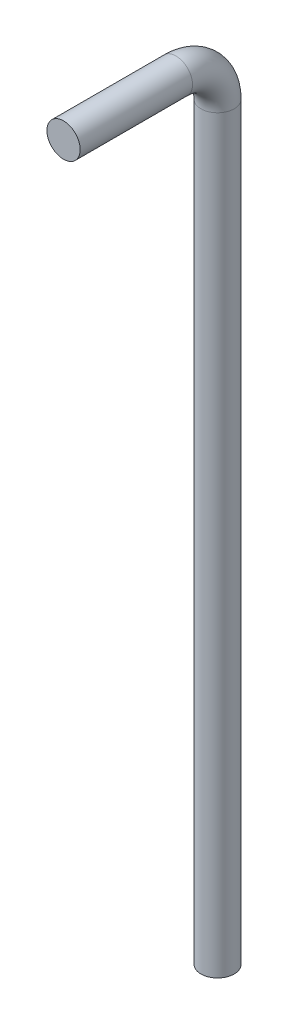
ISO-10303-21;
HEADER;
FILE_DESCRIPTION(('STEP AP214'),'2;1');
FILE_NAME('part.step','',(''),(''),'','','');
FILE_SCHEMA(('AUTOMOTIVE_DESIGN { 1 0 10303 214 1 1 1 1 }'));
ENDSEC;
DATA;
#1=APPLICATION_CONTEXT('core data for automotive mechanical design processes');
#2=APPLICATION_PROTOCOL_DEFINITION('international standard','automotive_design',2000,#1);
#3=PRODUCT_CONTEXT('',#1,'mechanical');
#4=PRODUCT('Part','Part','',(#3));
#5=PRODUCT_RELATED_PRODUCT_CATEGORY('part','',(#4));
#6=PRODUCT_DEFINITION_FORMATION('','',#4);
#7=PRODUCT_DEFINITION_CONTEXT('part definition',#1,'design');
#8=PRODUCT_DEFINITION('design','',#6,#7);
#9=PRODUCT_DEFINITION_SHAPE('','',#8);
#10=(LENGTH_UNIT() NAMED_UNIT(*) SI_UNIT(.MILLI.,.METRE.));
#11=(NAMED_UNIT(*) PLANE_ANGLE_UNIT() SI_UNIT($,.RADIAN.));
#12=(NAMED_UNIT(*) SI_UNIT($,.STERADIAN.) SOLID_ANGLE_UNIT());
#13=UNCERTAINTY_MEASURE_WITH_UNIT(LENGTH_MEASURE(1.E-05),#10,'distance_accuracy_value','');
#14=(GEOMETRIC_REPRESENTATION_CONTEXT(3) GLOBAL_UNCERTAINTY_ASSIGNED_CONTEXT((#13)) GLOBAL_UNIT_ASSIGNED_CONTEXT((#10,
#11,#12)) REPRESENTATION_CONTEXT('',''));
#15=CARTESIAN_POINT('',(0.,0.,0.));
#16=DIRECTION('',(0.,0.,1.));
#17=DIRECTION('',(1.,0.,0.));
#18=AXIS2_PLACEMENT_3D('',#15,#16,#17);
#19=CARTESIAN_POINT('',(0.,0.,0.));
#20=DIRECTION('',(0.,1.,0.));
#21=DIRECTION('',(0.,0.,1.));
#22=AXIS2_PLACEMENT_3D('',#19,#20,#21);
#23=PLANE('',#22);
#24=CARTESIAN_POINT('',(0.,0.,0.));
#25=DIRECTION('',(0.,1.,0.));
#26=DIRECTION('',(0.,0.,1.));
#27=AXIS2_PLACEMENT_3D('',#24,#25,#26);
#28=CIRCLE('',#27,5.08);
#29=CARTESIAN_POINT('',(0.,0.,5.08));
#30=VERTEX_POINT('',#29);
#31=EDGE_CURVE('E60',#30,#30,#28,.T.);
#32=ORIENTED_EDGE('',*,*,#31,.F.);
#33=EDGE_LOOP('',(#32));
#34=FACE_BOUND('',#33,.T.);
#35=ADVANCED_FACE('F43',(#34),#23,.F.);
#36=CARTESIAN_POINT('',(0.,241.3,46.99));
#37=DIRECTION('',(0.,0.,1.));
#38=DIRECTION('',(0.,-1.,0.));
#39=AXIS2_PLACEMENT_3D('',#36,#37,#38);
#40=PLANE('',#39);
#41=CARTESIAN_POINT('',(0.,241.3,46.99));
#42=DIRECTION('',(0.,0.,1.));
#43=DIRECTION('',(0.,-1.,0.));
#44=AXIS2_PLACEMENT_3D('',#41,#42,#43);
#45=CIRCLE('',#44,5.08);
#46=CARTESIAN_POINT('',(0.,236.22,46.99));
#47=VERTEX_POINT('',#46);
#48=EDGE_CURVE('E10',#47,#47,#45,.T.);
#49=ORIENTED_EDGE('',*,*,#48,.T.);
#50=EDGE_LOOP('',(#49));
#51=FACE_BOUND('',#50,.T.);
#52=ADVANCED_FACE('F69',(#51),#40,.T.);
#53=CARTESIAN_POINT('',(0.,0.,0.));
#54=DIRECTION('',(0.,1.,0.));
#55=DIRECTION('',(0.,0.,1.));
#56=AXIS2_PLACEMENT_3D('',#53,#54,#55);
#57=CYLINDRICAL_SURFACE('',#56,5.08);
#58=CARTESIAN_POINT('',(0.,228.6,0.));
#59=DIRECTION('',(0.,1.,0.));
#60=DIRECTION('',(0.,0.,1.));
#61=AXIS2_PLACEMENT_3D('',#58,#59,#60);
#62=CIRCLE('',#61,5.08);
#63=CARTESIAN_POINT('',(0.,228.6,-5.07999999999999));
#64=VERTEX_POINT('',#63);
#65=EDGE_CURVE('E55',#64,#64,#62,.T.);
#66=ORIENTED_EDGE('',*,*,#65,.F.);
#67=EDGE_LOOP('',(#66));
#68=FACE_BOUND('',#67,.T.);
#69=ORIENTED_EDGE('',*,*,#31,.T.);
#70=EDGE_LOOP('',(#69));
#71=FACE_BOUND('',#70,.T.);
#72=ADVANCED_FACE('F66',(#68,#71),#57,.T.);
#73=CARTESIAN_POINT('',(0.,228.6,12.7));
#74=DIRECTION('',(1.,0.,0.));
#75=DIRECTION('',(0.,0.,-1.));
#76=AXIS2_PLACEMENT_3D('',#73,#74,#75);
#77=TOROIDAL_SURFACE('',#76,12.7,5.08);
#78=CARTESIAN_POINT('',(0.,241.3,12.7));
#79=DIRECTION('',(0.,0.,1.));
#80=DIRECTION('',(0.,-1.,0.));
#81=AXIS2_PLACEMENT_3D('',#78,#79,#80);
#82=CIRCLE('',#81,5.08);
#83=CARTESIAN_POINT('',(0.,246.38,12.7));
#84=VERTEX_POINT('',#83);
#85=EDGE_CURVE('E50',#84,#84,#82,.T.);
#86=CARTESIAN_POINT('',(0.,228.6,12.7));
#87=DIRECTION('',(1.,0.,0.));
#88=DIRECTION('',(0.,0.,-1.));
#89=AXIS2_PLACEMENT_3D('',#86,#87,#88);
#90=CIRCLE('',#89,17.78);
#91=EDGE_CURVE('',#64,#84,#90,.T.);
#92=ORIENTED_EDGE('',*,*,#65,.T.);
#93=ORIENTED_EDGE('',*,*,#85,.F.);
#94=ORIENTED_EDGE('',*,*,#91,.T.);
#95=ORIENTED_EDGE('',*,*,#91,.F.);
#96=EDGE_LOOP('',(#92,#94,#93,#95));
#97=FACE_BOUND('',#96,.T.);
#98=ADVANCED_FACE('F75',(#97),#77,.T.);
#99=CARTESIAN_POINT('',(0.,241.3,12.7));
#100=DIRECTION('',(0.,0.,1.));
#101=DIRECTION('',(1.,0.,0.));
#102=AXIS2_PLACEMENT_3D('',#99,#100,#101);
#103=CYLINDRICAL_SURFACE('',#102,5.08);
#104=ORIENTED_EDGE('',*,*,#48,.F.);
#105=EDGE_LOOP('',(#104));
#106=FACE_BOUND('',#105,.T.);
#107=ORIENTED_EDGE('',*,*,#85,.T.);
#108=EDGE_LOOP('',(#107));
#109=FACE_BOUND('',#108,.T.);
#110=ADVANCED_FACE('F73',(#106,#109),#103,.T.);
#111=CLOSED_SHELL('',(#35,#52,#72,#98,#110));
#112=MANIFOLD_SOLID_BREP('B2',#111);
#113=ADVANCED_BREP_SHAPE_REPRESENTATION('',(#18,#112),#14);
#114=SHAPE_DEFINITION_REPRESENTATION(#9,#113);
ENDSEC;
END-ISO-10303-21;
